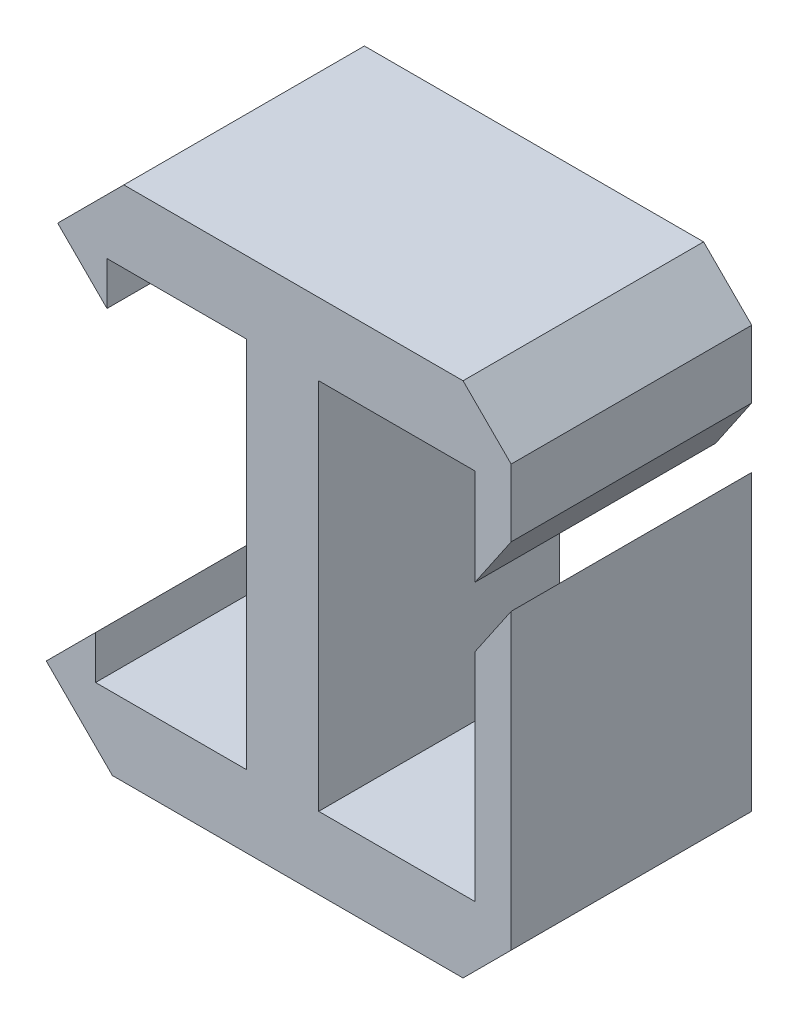
ISO-10303-21;
HEADER;
FILE_DESCRIPTION(('STEP AP214'),'2;1');
FILE_NAME('part.step','',(''),(''),'','','');
FILE_SCHEMA(('AUTOMOTIVE_DESIGN { 1 0 10303 214 1 1 1 1 }'));
ENDSEC;
DATA;
#1=APPLICATION_CONTEXT('core data for automotive mechanical design processes');
#2=APPLICATION_PROTOCOL_DEFINITION('international standard','automotive_design',2000,#1);
#3=PRODUCT_CONTEXT('',#1,'mechanical');
#4=PRODUCT('Part','Part','',(#3));
#5=PRODUCT_RELATED_PRODUCT_CATEGORY('part','',(#4));
#6=PRODUCT_DEFINITION_FORMATION('','',#4);
#7=PRODUCT_DEFINITION_CONTEXT('part definition',#1,'design');
#8=PRODUCT_DEFINITION('design','',#6,#7);
#9=PRODUCT_DEFINITION_SHAPE('','',#8);
#10=(LENGTH_UNIT() NAMED_UNIT(*) SI_UNIT(.MILLI.,.METRE.));
#11=(NAMED_UNIT(*) PLANE_ANGLE_UNIT() SI_UNIT($,.RADIAN.));
#12=(NAMED_UNIT(*) SI_UNIT($,.STERADIAN.) SOLID_ANGLE_UNIT());
#13=UNCERTAINTY_MEASURE_WITH_UNIT(LENGTH_MEASURE(1.E-05),#10,'distance_accuracy_value','');
#14=(GEOMETRIC_REPRESENTATION_CONTEXT(3) GLOBAL_UNCERTAINTY_ASSIGNED_CONTEXT((#13)) GLOBAL_UNIT_ASSIGNED_CONTEXT((#10,
#11,#12)) REPRESENTATION_CONTEXT('',''));
#15=CARTESIAN_POINT('',(0.,0.,0.));
#16=DIRECTION('',(0.,0.,1.));
#17=DIRECTION('',(1.,0.,0.));
#18=AXIS2_PLACEMENT_3D('',#15,#16,#17);
#19=CARTESIAN_POINT('',(-11.9544744209364,2.85150193237998,10.));
#20=DIRECTION('',(1.,0.,0.));
#21=DIRECTION('',(0.,1.,0.));
#22=AXIS2_PLACEMENT_3D('',#19,#20,#21);
#23=PLANE('',#22);
#24=DIRECTION('',(0.,-1.,0.));
#25=VECTOR('',#24,1.);
#26=CARTESIAN_POINT('',(-11.9544744209364,2.85150193237998,10.));
#27=LINE('',#26,#25);
#28=CARTESIAN_POINT('',(-11.9544744209364,3.1096578902488,10.));
#29=VERTEX_POINT('',#28);
#30=CARTESIAN_POINT('',(-11.9544744209364,1.3096578902488,10.));
#31=VERTEX_POINT('',#30);
#32=EDGE_CURVE('E216',#29,#31,#27,.T.);
#33=ORIENTED_EDGE('',*,*,#32,.T.);
#34=DIRECTION('',(0.,0.,1.));
#35=VECTOR('',#34,1.);
#36=CARTESIAN_POINT('',(-11.9544744209364,1.3096578902488,10.));
#37=LINE('',#36,#35);
#38=CARTESIAN_POINT('',(-11.9544744209364,1.3096578902488,0.));
#39=VERTEX_POINT('',#38);
#40=EDGE_CURVE('E391',#31,#39,#37,.F.);
#41=ORIENTED_EDGE('',*,*,#40,.T.);
#42=DIRECTION('',(0.,-1.,0.));
#43=VECTOR('',#42,1.);
#44=CARTESIAN_POINT('',(-11.9544744209364,2.85150193237998,0.));
#45=LINE('',#44,#43);
#46=CARTESIAN_POINT('',(-11.9544744209364,3.1096578902488,0.));
#47=VERTEX_POINT('',#46);
#48=EDGE_CURVE('E219',#47,#39,#45,.T.);
#49=ORIENTED_EDGE('',*,*,#48,.F.);
#50=DIRECTION('',(0.,0.,-1.));
#51=VECTOR('',#50,1.);
#52=CARTESIAN_POINT('',(-11.9544744209364,3.1096578902488,10.));
#53=LINE('',#52,#51);
#54=EDGE_CURVE('E214',#29,#47,#53,.T.);
#55=ORIENTED_EDGE('',*,*,#54,.F.);
#56=EDGE_LOOP('',(#33,#41,#49,#55));
#57=FACE_BOUND('',#56,.T.);
#58=ADVANCED_FACE('F16',(#57),#23,.T.);
#59=CARTESIAN_POINT('',(-6.16801259866785,3.1096578902488,10.));
#60=DIRECTION('',(0.,-1.,0.));
#61=DIRECTION('',(1.,0.,0.));
#62=AXIS2_PLACEMENT_3D('',#59,#60,#61);
#63=PLANE('',#62);
#64=DIRECTION('',(-1.,0.,0.));
#65=VECTOR('',#64,1.);
#66=CARTESIAN_POINT('',(-6.16801259866785,3.1096578902488,0.));
#67=LINE('',#66,#65);
#68=CARTESIAN_POINT('',(-6.15447442093638,3.1096578902488,0.));
#69=VERTEX_POINT('',#68);
#70=EDGE_CURVE('E296',#69,#47,#67,.T.);
#71=ORIENTED_EDGE('',*,*,#70,.F.);
#72=DIRECTION('',(0.,0.,-1.));
#73=VECTOR('',#72,1.);
#74=CARTESIAN_POINT('',(-6.15447442093638,3.1096578902488,10.));
#75=LINE('',#74,#73);
#76=CARTESIAN_POINT('',(-6.15447442093638,3.1096578902488,10.));
#77=VERTEX_POINT('',#76);
#78=EDGE_CURVE('E226',#77,#69,#75,.T.);
#79=ORIENTED_EDGE('',*,*,#78,.F.);
#80=DIRECTION('',(-1.,0.,0.));
#81=VECTOR('',#80,1.);
#82=CARTESIAN_POINT('',(-6.16801259866785,3.1096578902488,10.));
#83=LINE('',#82,#81);
#84=EDGE_CURVE('E231',#77,#29,#83,.T.);
#85=ORIENTED_EDGE('',*,*,#84,.T.);
#86=ORIENTED_EDGE('',*,*,#54,.T.);
#87=EDGE_LOOP('',(#71,#79,#85,#86));
#88=FACE_BOUND('',#87,.T.);
#89=ADVANCED_FACE('F238',(#88),#63,.T.);
#90=CARTESIAN_POINT('',(-6.15447442093638,-3.18937667277505,10.));
#91=DIRECTION('',(1.,0.,0.));
#92=DIRECTION('',(0.,1.,0.));
#93=AXIS2_PLACEMENT_3D('',#90,#91,#92);
#94=PLANE('',#93);
#95=DIRECTION('',(0.,-1.,0.));
#96=VECTOR('',#95,1.);
#97=CARTESIAN_POINT('',(-6.15447442093638,-3.18937667277505,0.));
#98=LINE('',#97,#96);
#99=CARTESIAN_POINT('',(-6.15447442093638,-12.3903421097512,0.));
#100=VERTEX_POINT('',#99);
#101=EDGE_CURVE('E298',#69,#100,#98,.T.);
#102=ORIENTED_EDGE('',*,*,#101,.T.);
#103=DIRECTION('',(0.,0.,-1.));
#104=VECTOR('',#103,1.);
#105=CARTESIAN_POINT('',(-6.15447442093638,-12.3903421097512,10.));
#106=LINE('',#105,#104);
#107=CARTESIAN_POINT('',(-6.15447442093638,-12.3903421097512,10.));
#108=VERTEX_POINT('',#107);
#109=EDGE_CURVE('E366',#108,#100,#106,.T.);
#110=ORIENTED_EDGE('',*,*,#109,.F.);
#111=DIRECTION('',(0.,-1.,0.));
#112=VECTOR('',#111,1.);
#113=CARTESIAN_POINT('',(-6.15447442093638,-3.18937667277505,10.));
#114=LINE('',#113,#112);
#115=EDGE_CURVE('E241',#77,#108,#114,.T.);
#116=ORIENTED_EDGE('',*,*,#115,.F.);
#117=ORIENTED_EDGE('',*,*,#78,.T.);
#118=EDGE_LOOP('',(#102,#110,#116,#117));
#119=FACE_BOUND('',#118,.T.);
#120=ADVANCED_FACE('F462',(#119),#94,.F.);
#121=CARTESIAN_POINT('',(-6.40506942601482,-12.3903421097512,10.));
#122=DIRECTION('',(0.,-1.,0.));
#123=DIRECTION('',(1.,0.,0.));
#124=AXIS2_PLACEMENT_3D('',#121,#122,#123);
#125=PLANE('',#124);
#126=DIRECTION('',(-1.,0.,0.));
#127=VECTOR('',#126,1.);
#128=CARTESIAN_POINT('',(-6.40506942601482,-12.3903421097512,0.));
#129=LINE('',#128,#127);
#130=CARTESIAN_POINT('',(-12.4285880756303,-12.3903421097512,0.));
#131=VERTEX_POINT('',#130);
#132=EDGE_CURVE('E309',#100,#131,#129,.T.);
#133=ORIENTED_EDGE('',*,*,#132,.T.);
#134=DIRECTION('',(0.,0.,-1.));
#135=VECTOR('',#134,1.);
#136=CARTESIAN_POINT('',(-12.4285880756303,-12.3903421097512,10.));
#137=LINE('',#136,#135);
#138=CARTESIAN_POINT('',(-12.4285880756303,-12.3903421097512,10.));
#139=VERTEX_POINT('',#138);
#140=EDGE_CURVE('E359',#139,#131,#137,.T.);
#141=ORIENTED_EDGE('',*,*,#140,.F.);
#142=DIRECTION('',(-1.,0.,0.));
#143=VECTOR('',#142,1.);
#144=CARTESIAN_POINT('',(-6.40506942601482,-12.3903421097512,10.));
#145=LINE('',#144,#143);
#146=EDGE_CURVE('E258',#108,#139,#145,.T.);
#147=ORIENTED_EDGE('',*,*,#146,.F.);
#148=ORIENTED_EDGE('',*,*,#109,.T.);
#149=EDGE_LOOP('',(#133,#141,#147,#148));
#150=FACE_BOUND('',#149,.T.);
#151=ADVANCED_FACE('F465',(#150),#125,.F.);
#152=CARTESIAN_POINT('',(-12.4285880756303,-13.1696809486542,10.));
#153=DIRECTION('',(-1.,0.,0.));
#154=DIRECTION('',(0.,-1.,0.));
#155=AXIS2_PLACEMENT_3D('',#152,#153,#154);
#156=PLANE('',#155);
#157=DIRECTION('',(0.,1.,0.));
#158=VECTOR('',#157,1.);
#159=CARTESIAN_POINT('',(-12.4285880756303,-13.1696809486542,0.));
#160=LINE('',#159,#158);
#161=CARTESIAN_POINT('',(-12.4285880756303,-10.5903421097512,0.));
#162=VERTEX_POINT('',#161);
#163=EDGE_CURVE('E312',#131,#162,#160,.T.);
#164=ORIENTED_EDGE('',*,*,#163,.T.);
#165=DIRECTION('',(0.,0.,-1.));
#166=VECTOR('',#165,1.);
#167=CARTESIAN_POINT('',(-12.4285880756303,-10.5903421097512,10.));
#168=LINE('',#167,#166);
#169=CARTESIAN_POINT('',(-12.4285880756303,-10.5903421097512,10.));
#170=VERTEX_POINT('',#169);
#171=EDGE_CURVE('E382',#162,#170,#168,.F.);
#172=ORIENTED_EDGE('',*,*,#171,.T.);
#173=DIRECTION('',(0.,1.,0.));
#174=VECTOR('',#173,1.);
#175=CARTESIAN_POINT('',(-12.4285880756303,-13.1696809486542,10.));
#176=LINE('',#175,#174);
#177=EDGE_CURVE('E261',#139,#170,#176,.T.);
#178=ORIENTED_EDGE('',*,*,#177,.F.);
#179=ORIENTED_EDGE('',*,*,#140,.T.);
#180=EDGE_LOOP('',(#164,#172,#178,#179));
#181=FACE_BOUND('',#180,.T.);
#182=ADVANCED_FACE('F549',(#181),#156,.F.);
#183=CARTESIAN_POINT('',(5.77486027864381,-15.3903421097512,10.));
#184=DIRECTION('',(0.,1.,0.));
#185=DIRECTION('',(0.,0.,1.));
#186=AXIS2_PLACEMENT_3D('',#183,#184,#185);
#187=PLANE('',#186);
#188=DIRECTION('',(1.,0.,0.));
#189=VECTOR('',#188,1.);
#190=CARTESIAN_POINT('',(5.77486027864381,-15.3903421097512,0.));
#191=LINE('',#190,#189);
#192=CARTESIAN_POINT('',(-11.7285880756303,-15.3903421097512,0.));
#193=VERTEX_POINT('',#192);
#194=CARTESIAN_POINT('',(2.84552557906362,-15.3903421097512,0.));
#195=VERTEX_POINT('',#194);
#196=EDGE_CURVE('E301',#193,#195,#191,.T.);
#197=ORIENTED_EDGE('',*,*,#196,.T.);
#198=DIRECTION('',(0.,0.,1.));
#199=VECTOR('',#198,1.);
#200=CARTESIAN_POINT('',(2.84552557906362,-15.3903421097512,10.));
#201=LINE('',#200,#199);
#202=CARTESIAN_POINT('',(2.84552557906362,-15.3903421097512,10.));
#203=VERTEX_POINT('',#202);
#204=EDGE_CURVE('E430',#195,#203,#201,.T.);
#205=ORIENTED_EDGE('',*,*,#204,.T.);
#206=DIRECTION('',(1.,0.,0.));
#207=VECTOR('',#206,1.);
#208=CARTESIAN_POINT('',(5.77486027864381,-15.3903421097512,10.));
#209=LINE('',#208,#207);
#210=CARTESIAN_POINT('',(-11.7285880756303,-15.3903421097512,10.));
#211=VERTEX_POINT('',#210);
#212=EDGE_CURVE('E247',#211,#203,#209,.T.);
#213=ORIENTED_EDGE('',*,*,#212,.F.);
#214=DIRECTION('',(0.,0.,-1.));
#215=VECTOR('',#214,1.);
#216=CARTESIAN_POINT('',(-11.7285880756303,-15.3903421097512,0.));
#217=LINE('',#216,#215);
#218=EDGE_CURVE('E394',#211,#193,#217,.T.);
#219=ORIENTED_EDGE('',*,*,#218,.T.);
#220=EDGE_LOOP('',(#197,#205,#213,#219));
#221=FACE_BOUND('',#220,.T.);
#222=ADVANCED_FACE('F482',(#221),#187,.F.);
#223=CARTESIAN_POINT('',(4.84552557906362,-13.674775353497,10.));
#224=DIRECTION('',(-1.,0.,0.));
#225=DIRECTION('',(0.,-1.,0.));
#226=AXIS2_PLACEMENT_3D('',#223,#224,#225);
#227=PLANE('',#226);
#228=DIRECTION('',(0.,1.,0.));
#229=VECTOR('',#228,1.);
#230=CARTESIAN_POINT('',(4.84552557906362,-13.674775353497,10.));
#231=LINE('',#230,#229);
#232=CARTESIAN_POINT('',(4.84552557906362,-13.3903421097512,10.));
#233=VERTEX_POINT('',#232);
#234=CARTESIAN_POINT('',(4.84552557906362,-1.1903421097512,10.));
#235=VERTEX_POINT('',#234);
#236=EDGE_CURVE('E265',#233,#235,#231,.T.);
#237=ORIENTED_EDGE('',*,*,#236,.F.);
#238=DIRECTION('',(0.,0.,-1.));
#239=VECTOR('',#238,1.);
#240=CARTESIAN_POINT('',(4.84552557906362,-13.3903421097512,10.));
#241=LINE('',#240,#239);
#242=CARTESIAN_POINT('',(4.84552557906362,-13.3903421097512,0.));
#243=VERTEX_POINT('',#242);
#244=EDGE_CURVE('E421',#233,#243,#241,.T.);
#245=ORIENTED_EDGE('',*,*,#244,.T.);
#246=DIRECTION('',(0.,1.,0.));
#247=VECTOR('',#246,1.);
#248=CARTESIAN_POINT('',(4.84552557906362,-13.674775353497,0.));
#249=LINE('',#248,#247);
#250=CARTESIAN_POINT('',(4.84552557906362,-1.1903421097512,0.));
#251=VERTEX_POINT('',#250);
#252=EDGE_CURVE('E316',#243,#251,#249,.T.);
#253=ORIENTED_EDGE('',*,*,#252,.T.);
#254=DIRECTION('',(0.,0.,-1.));
#255=VECTOR('',#254,1.);
#256=CARTESIAN_POINT('',(4.84552557906362,-1.1903421097512,10.));
#257=LINE('',#256,#255);
#258=EDGE_CURVE('E354',#235,#251,#257,.T.);
#259=ORIENTED_EDGE('',*,*,#258,.F.);
#260=EDGE_LOOP('',(#237,#245,#253,#259));
#261=FACE_BOUND('',#260,.T.);
#262=ADVANCED_FACE('F492',(#261),#227,.F.);
#263=CARTESIAN_POINT('',(4.67106450063209,-1.44621835811745,10.));
#264=DIRECTION('',(-0.826227342807548,0.56333682464151,0.));
#265=DIRECTION('',(-0.56333682464151,-0.826227342807548,0.));
#266=AXIS2_PLACEMENT_3D('',#263,#264,#265);
#267=PLANE('',#266);
#268=DIRECTION('',(0.56333682464151,0.826227342807548,0.));
#269=VECTOR('',#268,1.);
#270=CARTESIAN_POINT('',(4.67106450063209,-1.44621835811745,0.));
#271=LINE('',#270,#269);
#272=CARTESIAN_POINT('',(3.34552557906362,-3.3903421097512,0.));
#273=VERTEX_POINT('',#272);
#274=EDGE_CURVE('E322',#273,#251,#271,.T.);
#275=ORIENTED_EDGE('',*,*,#274,.F.);
#276=DIRECTION('',(0.,0.,-1.));
#277=VECTOR('',#276,1.);
#278=CARTESIAN_POINT('',(3.34552557906362,-3.3903421097512,10.));
#279=LINE('',#278,#277);
#280=CARTESIAN_POINT('',(3.34552557906362,-3.3903421097512,10.));
#281=VERTEX_POINT('',#280);
#282=EDGE_CURVE('E351',#281,#273,#279,.T.);
#283=ORIENTED_EDGE('',*,*,#282,.F.);
#284=DIRECTION('',(0.56333682464151,0.826227342807548,0.));
#285=VECTOR('',#284,1.);
#286=CARTESIAN_POINT('',(4.67106450063209,-1.44621835811745,10.));
#287=LINE('',#286,#285);
#288=EDGE_CURVE('E271',#281,#235,#287,.T.);
#289=ORIENTED_EDGE('',*,*,#288,.T.);
#290=ORIENTED_EDGE('',*,*,#258,.T.);
#291=EDGE_LOOP('',(#275,#283,#289,#290));
#292=FACE_BOUND('',#291,.T.);
#293=ADVANCED_FACE('F495',(#292),#267,.T.);
#294=CARTESIAN_POINT('',(3.34552557906362,-4.49034210975119,10.));
#295=DIRECTION('',(-1.,0.,0.));
#296=DIRECTION('',(0.,-1.,0.));
#297=AXIS2_PLACEMENT_3D('',#294,#295,#296);
#298=PLANE('',#297);
#299=DIRECTION('',(0.,1.,0.));
#300=VECTOR('',#299,1.);
#301=CARTESIAN_POINT('',(3.34552557906362,-4.49034210975119,0.));
#302=LINE('',#301,#300);
#303=CARTESIAN_POINT('',(3.34552557906362,-12.3903421097512,0.));
#304=VERTEX_POINT('',#303);
#305=EDGE_CURVE('E326',#304,#273,#302,.T.);
#306=ORIENTED_EDGE('',*,*,#305,.F.);
#307=DIRECTION('',(0.,0.,-1.));
#308=VECTOR('',#307,1.);
#309=CARTESIAN_POINT('',(3.34552557906362,-12.3903421097512,10.));
#310=LINE('',#309,#308);
#311=CARTESIAN_POINT('',(3.34552557906362,-12.3903421097512,10.));
#312=VERTEX_POINT('',#311);
#313=EDGE_CURVE('E355',#312,#304,#310,.T.);
#314=ORIENTED_EDGE('',*,*,#313,.F.);
#315=DIRECTION('',(0.,1.,0.));
#316=VECTOR('',#315,1.);
#317=CARTESIAN_POINT('',(3.34552557906362,-4.49034210975119,10.));
#318=LINE('',#317,#316);
#319=EDGE_CURVE('E275',#312,#281,#318,.T.);
#320=ORIENTED_EDGE('',*,*,#319,.T.);
#321=ORIENTED_EDGE('',*,*,#282,.T.);
#322=EDGE_LOOP('',(#306,#314,#320,#321));
#323=FACE_BOUND('',#322,.T.);
#324=ADVANCED_FACE('F499',(#323),#298,.T.);
#325=CARTESIAN_POINT('',(2.84552557906362,-12.3903421097512,10.));
#326=DIRECTION('',(0.,-1.,0.));
#327=DIRECTION('',(1.,0.,0.));
#328=AXIS2_PLACEMENT_3D('',#325,#326,#327);
#329=PLANE('',#328);
#330=DIRECTION('',(-1.,0.,0.));
#331=VECTOR('',#330,1.);
#332=CARTESIAN_POINT('',(2.84552557906362,-12.3903421097512,0.));
#333=LINE('',#332,#331);
#334=CARTESIAN_POINT('',(-3.15447442093638,-12.3903421097512,0.));
#335=VERTEX_POINT('',#334);
#336=EDGE_CURVE('E319',#304,#335,#333,.T.);
#337=ORIENTED_EDGE('',*,*,#336,.T.);
#338=DIRECTION('',(0.,0.,-1.));
#339=VECTOR('',#338,1.);
#340=CARTESIAN_POINT('',(-3.15447442093638,-12.3903421097512,10.));
#341=LINE('',#340,#339);
#342=CARTESIAN_POINT('',(-3.15447442093638,-12.3903421097512,10.));
#343=VERTEX_POINT('',#342);
#344=EDGE_CURVE('E362',#343,#335,#341,.T.);
#345=ORIENTED_EDGE('',*,*,#344,.F.);
#346=DIRECTION('',(-1.,0.,0.));
#347=VECTOR('',#346,1.);
#348=CARTESIAN_POINT('',(2.84552557906362,-12.3903421097512,10.));
#349=LINE('',#348,#347);
#350=EDGE_CURVE('E268',#312,#343,#349,.T.);
#351=ORIENTED_EDGE('',*,*,#350,.F.);
#352=ORIENTED_EDGE('',*,*,#313,.T.);
#353=EDGE_LOOP('',(#337,#345,#351,#352));
#354=FACE_BOUND('',#353,.T.);
#355=ADVANCED_FACE('F504',(#354),#329,.F.);
#356=CARTESIAN_POINT('',(-3.15447442093638,-2.38937667277505,10.));
#357=DIRECTION('',(1.,0.,0.));
#358=DIRECTION('',(0.,1.,0.));
#359=AXIS2_PLACEMENT_3D('',#356,#357,#358);
#360=PLANE('',#359);
#361=DIRECTION('',(0.,-1.,0.));
#362=VECTOR('',#361,1.);
#363=CARTESIAN_POINT('',(-3.15447442093638,-2.38937667277505,0.));
#364=LINE('',#363,#362);
#365=CARTESIAN_POINT('',(-3.15447442093638,3.1096578902488,0.));
#366=VERTEX_POINT('',#365);
#367=EDGE_CURVE('E305',#366,#335,#364,.T.);
#368=ORIENTED_EDGE('',*,*,#367,.F.);
#369=DIRECTION('',(0.,0.,-1.));
#370=VECTOR('',#369,1.);
#371=CARTESIAN_POINT('',(-3.15447442093638,3.1096578902488,10.));
#372=LINE('',#371,#370);
#373=CARTESIAN_POINT('',(-3.15447442093638,3.1096578902488,10.));
#374=VERTEX_POINT('',#373);
#375=EDGE_CURVE('E350',#374,#366,#372,.T.);
#376=ORIENTED_EDGE('',*,*,#375,.F.);
#377=DIRECTION('',(0.,-1.,0.));
#378=VECTOR('',#377,1.);
#379=CARTESIAN_POINT('',(-3.15447442093638,-2.38937667277505,10.));
#380=LINE('',#379,#378);
#381=EDGE_CURVE('E254',#374,#343,#380,.T.);
#382=ORIENTED_EDGE('',*,*,#381,.T.);
#383=ORIENTED_EDGE('',*,*,#344,.T.);
#384=EDGE_LOOP('',(#368,#376,#382,#383));
#385=FACE_BOUND('',#384,.T.);
#386=ADVANCED_FACE('F511',(#385),#360,.T.);
#387=CARTESIAN_POINT('',(6.35776181216465,3.1096578902488,10.));
#388=DIRECTION('',(0.,1.,0.));
#389=DIRECTION('',(0.,0.,1.));
#390=AXIS2_PLACEMENT_3D('',#387,#388,#389);
#391=PLANE('',#390);
#392=DIRECTION('',(1.,0.,0.));
#393=VECTOR('',#392,1.);
#394=CARTESIAN_POINT('',(6.35776181216465,3.1096578902488,0.));
#395=LINE('',#394,#393);
#396=CARTESIAN_POINT('',(3.34552557906362,3.1096578902488,0.));
#397=VERTEX_POINT('',#396);
#398=EDGE_CURVE('E330',#366,#397,#395,.T.);
#399=ORIENTED_EDGE('',*,*,#398,.T.);
#400=DIRECTION('',(0.,0.,-1.));
#401=VECTOR('',#400,1.);
#402=CARTESIAN_POINT('',(3.34552557906362,3.1096578902488,10.));
#403=LINE('',#402,#401);
#404=CARTESIAN_POINT('',(3.34552557906362,3.1096578902488,10.));
#405=VERTEX_POINT('',#404);
#406=EDGE_CURVE('E347',#405,#397,#403,.T.);
#407=ORIENTED_EDGE('',*,*,#406,.F.);
#408=DIRECTION('',(1.,0.,0.));
#409=VECTOR('',#408,1.);
#410=CARTESIAN_POINT('',(6.35776181216465,3.1096578902488,10.));
#411=LINE('',#410,#409);
#412=EDGE_CURVE('E279',#374,#405,#411,.T.);
#413=ORIENTED_EDGE('',*,*,#412,.F.);
#414=ORIENTED_EDGE('',*,*,#375,.T.);
#415=EDGE_LOOP('',(#399,#407,#413,#414));
#416=FACE_BOUND('',#415,.T.);
#417=ADVANCED_FACE('F514',(#416),#391,.F.);
#418=CARTESIAN_POINT('',(3.34552557906362,-0.890342109751197,0.));
#419=VERTEX_POINT('',#418);
#420=EDGE_CURVE('E331',#419,#397,#302,.T.);
#421=ORIENTED_EDGE('',*,*,#420,.F.);
#422=DIRECTION('',(0.,0.,-1.));
#423=VECTOR('',#422,1.);
#424=CARTESIAN_POINT('',(3.34552557906362,-0.890342109751197,10.));
#425=LINE('',#424,#423);
#426=CARTESIAN_POINT('',(3.34552557906362,-0.890342109751197,10.));
#427=VERTEX_POINT('',#426);
#428=EDGE_CURVE('E344',#427,#419,#425,.T.);
#429=ORIENTED_EDGE('',*,*,#428,.F.);
#430=EDGE_CURVE('E280',#427,#405,#318,.T.);
#431=ORIENTED_EDGE('',*,*,#430,.T.);
#432=ORIENTED_EDGE('',*,*,#406,.T.);
#433=EDGE_LOOP('',(#421,#429,#431,#432));
#434=FACE_BOUND('',#433,.T.);
#435=ADVANCED_FACE('F519',(#434),#298,.T.);
#436=CARTESIAN_POINT('',(4.96272062950624,1.48154396423131,10.));
#437=DIRECTION('',(-0.826227342807548,0.56333682464151,0.));
#438=DIRECTION('',(-0.56333682464151,-0.826227342807548,0.));
#439=AXIS2_PLACEMENT_3D('',#436,#437,#438);
#440=PLANE('',#439);
#441=DIRECTION('',(0.56333682464151,0.826227342807548,0.));
#442=VECTOR('',#441,1.);
#443=CARTESIAN_POINT('',(4.96272062950624,1.48154396423131,0.));
#444=LINE('',#443,#442);
#445=CARTESIAN_POINT('',(4.84552557906362,1.3096578902488,0.));
#446=VERTEX_POINT('',#445);
#447=EDGE_CURVE('E236',#419,#446,#444,.T.);
#448=ORIENTED_EDGE('',*,*,#447,.T.);
#449=DIRECTION('',(0.,0.,-1.));
#450=VECTOR('',#449,1.);
#451=CARTESIAN_POINT('',(4.84552557906362,1.3096578902488,10.));
#452=LINE('',#451,#450);
#453=CARTESIAN_POINT('',(4.84552557906362,1.3096578902488,10.));
#454=VERTEX_POINT('',#453);
#455=EDGE_CURVE('E290',#454,#446,#452,.T.);
#456=ORIENTED_EDGE('',*,*,#455,.F.);
#457=DIRECTION('',(0.56333682464151,0.826227342807548,0.));
#458=VECTOR('',#457,1.);
#459=CARTESIAN_POINT('',(4.96272062950624,1.48154396423131,10.));
#460=LINE('',#459,#458);
#461=EDGE_CURVE('E286',#427,#454,#460,.T.);
#462=ORIENTED_EDGE('',*,*,#461,.F.);
#463=ORIENTED_EDGE('',*,*,#428,.T.);
#464=EDGE_LOOP('',(#448,#456,#462,#463));
#465=FACE_BOUND('',#464,.T.);
#466=ADVANCED_FACE('F575',(#465),#440,.F.);
#467=CARTESIAN_POINT('',(4.84552557906362,4.53824315084691,10.));
#468=DIRECTION('',(1.,0.,0.));
#469=DIRECTION('',(0.,1.,0.));
#470=AXIS2_PLACEMENT_3D('',#467,#468,#469);
#471=PLANE('',#470);
#472=DIRECTION('',(0.,-1.,0.));
#473=VECTOR('',#472,1.);
#474=CARTESIAN_POINT('',(4.84552557906362,4.53824315084691,0.));
#475=LINE('',#474,#473);
#476=CARTESIAN_POINT('',(4.84552557906362,4.10965789024881,0.));
#477=VERTEX_POINT('',#476);
#478=EDGE_CURVE('E335',#477,#446,#475,.T.);
#479=ORIENTED_EDGE('',*,*,#478,.F.);
#480=DIRECTION('',(0.,0.,1.));
#481=VECTOR('',#480,1.);
#482=CARTESIAN_POINT('',(4.84552557906362,4.10965789024881,10.));
#483=LINE('',#482,#481);
#484=CARTESIAN_POINT('',(4.84552557906362,4.10965789024881,10.));
#485=VERTEX_POINT('',#484);
#486=EDGE_CURVE('E10',#477,#485,#483,.T.);
#487=ORIENTED_EDGE('',*,*,#486,.T.);
#488=DIRECTION('',(0.,-1.,0.));
#489=VECTOR('',#488,1.);
#490=CARTESIAN_POINT('',(4.84552557906362,4.53824315084691,10.));
#491=LINE('',#490,#489);
#492=EDGE_CURVE('E283',#485,#454,#491,.T.);
#493=ORIENTED_EDGE('',*,*,#492,.T.);
#494=ORIENTED_EDGE('',*,*,#455,.T.);
#495=EDGE_LOOP('',(#479,#487,#493,#494));
#496=FACE_BOUND('',#495,.T.);
#497=ADVANCED_FACE('F585',(#496),#471,.T.);
#498=CARTESIAN_POINT('',(-6.16801259866785,6.1096578902488,10.));
#499=DIRECTION('',(0.,-1.,0.));
#500=DIRECTION('',(1.,0.,0.));
#501=AXIS2_PLACEMENT_3D('',#498,#499,#500);
#502=PLANE('',#501);
#503=DIRECTION('',(-1.,0.,0.));
#504=VECTOR('',#503,1.);
#505=CARTESIAN_POINT('',(-6.16801259866785,6.1096578902488,10.));
#506=LINE('',#505,#504);
#507=CARTESIAN_POINT('',(2.84552557906362,6.1096578902488,10.));
#508=VERTEX_POINT('',#507);
#509=CARTESIAN_POINT('',(-11.2544744209364,6.1096578902488,10.));
#510=VERTEX_POINT('',#509);
#511=EDGE_CURVE('E235',#508,#510,#506,.T.);
#512=ORIENTED_EDGE('',*,*,#511,.F.);
#513=DIRECTION('',(0.,0.,-1.));
#514=VECTOR('',#513,1.);
#515=CARTESIAN_POINT('',(2.84552557906362,6.1096578902488,0.));
#516=LINE('',#515,#514);
#517=CARTESIAN_POINT('',(2.84552557906362,6.1096578902488,0.));
#518=VERTEX_POINT('',#517);
#519=EDGE_CURVE('E25',#508,#518,#516,.T.);
#520=ORIENTED_EDGE('',*,*,#519,.T.);
#521=DIRECTION('',(-1.,0.,0.));
#522=VECTOR('',#521,1.);
#523=CARTESIAN_POINT('',(-6.16801259866785,6.1096578902488,0.));
#524=LINE('',#523,#522);
#525=CARTESIAN_POINT('',(-11.2544744209364,6.1096578902488,0.));
#526=VERTEX_POINT('',#525);
#527=EDGE_CURVE('E293',#518,#526,#524,.T.);
#528=ORIENTED_EDGE('',*,*,#527,.T.);
#529=DIRECTION('',(0.,0.,1.));
#530=VECTOR('',#529,1.);
#531=CARTESIAN_POINT('',(-11.2544744209364,6.1096578902488,10.));
#532=LINE('',#531,#530);
#533=EDGE_CURVE('E417',#526,#510,#532,.T.);
#534=ORIENTED_EDGE('',*,*,#533,.T.);
#535=EDGE_LOOP('',(#512,#520,#528,#534));
#536=FACE_BOUND('',#535,.T.);
#537=ADVANCED_FACE('F443',(#536),#502,.F.);
#538=CARTESIAN_POINT('',(-4.19153124828335,-4.6403421097512,10.));
#539=DIRECTION('',(0.,0.,1.));
#540=DIRECTION('',(1.,0.,0.));
#541=AXIS2_PLACEMENT_3D('',#538,#539,#540);
#542=PLANE('',#541);
#543=ORIENTED_EDGE('',*,*,#212,.T.);
#544=DIRECTION('',(-0.707106781186548,-0.707106781186548,0.));
#545=VECTOR('',#544,1.);
#546=CARTESIAN_POINT('',(4.70199716539014,-13.5338705234247,10.));
#547=LINE('',#546,#545);
#548=EDGE_CURVE('E435',#203,#233,#547,.F.);
#549=ORIENTED_EDGE('',*,*,#548,.T.);
#550=ORIENTED_EDGE('',*,*,#236,.T.);
#551=ORIENTED_EDGE('',*,*,#288,.F.);
#552=ORIENTED_EDGE('',*,*,#319,.F.);
#553=ORIENTED_EDGE('',*,*,#350,.T.);
#554=ORIENTED_EDGE('',*,*,#381,.F.);
#555=ORIENTED_EDGE('',*,*,#412,.T.);
#556=ORIENTED_EDGE('',*,*,#430,.F.);
#557=ORIENTED_EDGE('',*,*,#461,.T.);
#558=ORIENTED_EDGE('',*,*,#492,.F.);
#559=DIRECTION('',(-0.707106781186548,0.707106781186547,0.));
#560=VECTOR('',#559,1.);
#561=CARTESIAN_POINT('',(4.70199716539013,4.25318630392229,10.));
#562=LINE('',#561,#560);
#563=EDGE_CURVE('E37',#485,#508,#562,.T.);
#564=ORIENTED_EDGE('',*,*,#563,.T.);
#565=ORIENTED_EDGE('',*,*,#511,.T.);
#566=DIRECTION('',(0.707106781186548,0.707106781186548,0.));
#567=VECTOR('',#566,1.);
#568=CARTESIAN_POINT('',(-13.0980028346099,4.26612947657532,10.));
#569=LINE('',#568,#567);
#570=CARTESIAN_POINT('',(-14.0044744209364,3.3596578902488,10.));
#571=VERTEX_POINT('',#570);
#572=EDGE_CURVE('E408',#510,#571,#569,.F.);
#573=ORIENTED_EDGE('',*,*,#572,.T.);
#574=DIRECTION('',(-0.707106781186548,0.707106781186548,0.));
#575=VECTOR('',#574,1.);
#576=CARTESIAN_POINT('',(-5.09800283460986,-5.54681369607771,10.));
#577=LINE('',#576,#575);
#578=EDGE_CURVE('E233',#571,#31,#577,.F.);
#579=ORIENTED_EDGE('',*,*,#578,.T.);
#580=ORIENTED_EDGE('',*,*,#32,.F.);
#581=ORIENTED_EDGE('',*,*,#84,.F.);
#582=ORIENTED_EDGE('',*,*,#115,.T.);
#583=ORIENTED_EDGE('',*,*,#146,.T.);
#584=ORIENTED_EDGE('',*,*,#177,.T.);
#585=DIRECTION('',(0.707106781186548,0.707106781186548,0.));
#586=VECTOR('',#585,1.);
#587=CARTESIAN_POINT('',(-5.33505966195683,-3.49681369607771,10.));
#588=LINE('',#587,#586);
#589=CARTESIAN_POINT('',(-14.4785880756303,-12.6403421097512,10.));
#590=VERTEX_POINT('',#589);
#591=EDGE_CURVE('E387',#170,#590,#588,.F.);
#592=ORIENTED_EDGE('',*,*,#591,.T.);
#593=DIRECTION('',(0.707106781186547,-0.707106781186548,0.));
#594=VECTOR('',#593,1.);
#595=CARTESIAN_POINT('',(-13.3350596619568,-13.7838705234247,10.));
#596=LINE('',#595,#594);
#597=EDGE_CURVE('E411',#590,#211,#596,.T.);
#598=ORIENTED_EDGE('',*,*,#597,.T.);
#599=EDGE_LOOP('',(#543,#549,#550,#551,#552,#553,#554,#555,#556,#557,#558,#564,#565,#573,#579,
#580,#581,#582,#583,#584,#592,#598));
#600=FACE_BOUND('',#599,.T.);
#601=ADVANCED_FACE('F230',(#600),#542,.T.);
#602=CARTESIAN_POINT('',(-4.19153124828335,-4.6403421097512,0.));
#603=DIRECTION('',(0.,0.,1.));
#604=DIRECTION('',(1.,0.,0.));
#605=AXIS2_PLACEMENT_3D('',#602,#603,#604);
#606=PLANE('',#605);
#607=ORIENTED_EDGE('',*,*,#252,.F.);
#608=DIRECTION('',(0.707106781186548,0.707106781186548,0.));
#609=VECTOR('',#608,1.);
#610=CARTESIAN_POINT('',(4.84552557906362,-13.3903421097512,0.));
#611=LINE('',#610,#609);
#612=EDGE_CURVE('E427',#243,#195,#611,.F.);
#613=ORIENTED_EDGE('',*,*,#612,.T.);
#614=ORIENTED_EDGE('',*,*,#196,.F.);
#615=DIRECTION('',(-0.707106781186547,0.707106781186548,0.));
#616=VECTOR('',#615,1.);
#617=CARTESIAN_POINT('',(-11.7285880756303,-15.3903421097512,0.));
#618=LINE('',#617,#616);
#619=CARTESIAN_POINT('',(-14.4785880756303,-12.6403421097512,0.));
#620=VERTEX_POINT('',#619);
#621=EDGE_CURVE('E402',#193,#620,#618,.T.);
#622=ORIENTED_EDGE('',*,*,#621,.T.);
#623=DIRECTION('',(-0.707106781186548,-0.707106781186548,0.));
#624=VECTOR('',#623,1.);
#625=CARTESIAN_POINT('',(-15.2285880756303,-13.3903421097512,0.));
#626=LINE('',#625,#624);
#627=EDGE_CURVE('E379',#620,#162,#626,.F.);
#628=ORIENTED_EDGE('',*,*,#627,.T.);
#629=ORIENTED_EDGE('',*,*,#163,.F.);
#630=ORIENTED_EDGE('',*,*,#132,.F.);
#631=ORIENTED_EDGE('',*,*,#101,.F.);
#632=ORIENTED_EDGE('',*,*,#70,.T.);
#633=ORIENTED_EDGE('',*,*,#48,.T.);
#634=DIRECTION('',(0.707106781186548,-0.707106781186548,0.));
#635=VECTOR('',#634,1.);
#636=CARTESIAN_POINT('',(-11.7544744209364,1.1096578902488,0.));
#637=LINE('',#636,#635);
#638=CARTESIAN_POINT('',(-14.0044744209364,3.3596578902488,0.));
#639=VERTEX_POINT('',#638);
#640=EDGE_CURVE('E225',#39,#639,#637,.F.);
#641=ORIENTED_EDGE('',*,*,#640,.T.);
#642=DIRECTION('',(-0.707106781186548,-0.707106781186548,0.));
#643=VECTOR('',#642,1.);
#644=CARTESIAN_POINT('',(-14.7544744209364,2.6096578902488,0.));
#645=LINE('',#644,#643);
#646=EDGE_CURVE('E398',#639,#526,#645,.F.);
#647=ORIENTED_EDGE('',*,*,#646,.T.);
#648=ORIENTED_EDGE('',*,*,#527,.F.);
#649=DIRECTION('',(0.707106781186548,-0.707106781186547,0.));
#650=VECTOR('',#649,1.);
#651=CARTESIAN_POINT('',(2.84552557906362,6.1096578902488,0.));
#652=LINE('',#651,#650);
#653=EDGE_CURVE('E424',#518,#477,#652,.T.);
#654=ORIENTED_EDGE('',*,*,#653,.T.);
#655=ORIENTED_EDGE('',*,*,#478,.T.);
#656=ORIENTED_EDGE('',*,*,#447,.F.);
#657=ORIENTED_EDGE('',*,*,#420,.T.);
#658=ORIENTED_EDGE('',*,*,#398,.F.);
#659=ORIENTED_EDGE('',*,*,#367,.T.);
#660=ORIENTED_EDGE('',*,*,#336,.F.);
#661=ORIENTED_EDGE('',*,*,#305,.T.);
#662=ORIENTED_EDGE('',*,*,#274,.T.);
#663=EDGE_LOOP('',(#607,#613,#614,#622,#628,#629,#630,#631,#632,#633,#641,#647,#648,#654,#655,
#656,#657,#658,#659,#660,#661,#662));
#664=FACE_BOUND('',#663,.T.);
#665=ADVANCED_FACE('F447',(#664),#606,.F.);
#666=CARTESIAN_POINT('',(-15.2285880756303,-13.3903421097512,10.));
#667=DIRECTION('',(0.707106781186548,-0.707106781186548,0.));
#668=DIRECTION('',(0.,0.,-1.));
#669=AXIS2_PLACEMENT_3D('',#666,#667,#668);
#670=PLANE('',#669);
#671=ORIENTED_EDGE('',*,*,#627,.F.);
#672=DIRECTION('',(0.,0.,-1.));
#673=VECTOR('',#672,1.);
#674=CARTESIAN_POINT('',(-14.4785880756303,-12.6403421097512,10.));
#675=LINE('',#674,#673);
#676=EDGE_CURVE('E405',#620,#590,#675,.F.);
#677=ORIENTED_EDGE('',*,*,#676,.T.);
#678=ORIENTED_EDGE('',*,*,#591,.F.);
#679=ORIENTED_EDGE('',*,*,#171,.F.);
#680=EDGE_LOOP('',(#671,#677,#678,#679));
#681=FACE_BOUND('',#680,.T.);
#682=ADVANCED_FACE('F474',(#681),#670,.F.);
#683=CARTESIAN_POINT('',(-11.7544744209364,1.1096578902488,10.));
#684=DIRECTION('',(0.707106781186548,0.707106781186548,0.));
#685=DIRECTION('',(0.,0.,-1.));
#686=AXIS2_PLACEMENT_3D('',#683,#684,#685);
#687=PLANE('',#686);
#688=ORIENTED_EDGE('',*,*,#578,.F.);
#689=DIRECTION('',(0.,0.,-1.));
#690=VECTOR('',#689,1.);
#691=CARTESIAN_POINT('',(-14.0044744209364,3.3596578902488,10.));
#692=LINE('',#691,#690);
#693=EDGE_CURVE('E414',#571,#639,#692,.T.);
#694=ORIENTED_EDGE('',*,*,#693,.T.);
#695=ORIENTED_EDGE('',*,*,#640,.F.);
#696=ORIENTED_EDGE('',*,*,#40,.F.);
#697=EDGE_LOOP('',(#688,#694,#695,#696));
#698=FACE_BOUND('',#697,.T.);
#699=ADVANCED_FACE('F456',(#698),#687,.F.);
#700=CARTESIAN_POINT('',(-11.7285880756303,-15.3903421097512,10.));
#701=DIRECTION('',(-0.707106781186548,-0.707106781186547,0.));
#702=DIRECTION('',(0.,0.,1.));
#703=AXIS2_PLACEMENT_3D('',#700,#701,#702);
#704=PLANE('',#703);
#705=ORIENTED_EDGE('',*,*,#597,.F.);
#706=ORIENTED_EDGE('',*,*,#676,.F.);
#707=ORIENTED_EDGE('',*,*,#621,.F.);
#708=ORIENTED_EDGE('',*,*,#218,.F.);
#709=EDGE_LOOP('',(#705,#706,#707,#708));
#710=FACE_BOUND('',#709,.T.);
#711=ADVANCED_FACE('F477',(#710),#704,.T.);
#712=CARTESIAN_POINT('',(-14.7544744209364,2.6096578902488,10.));
#713=DIRECTION('',(0.707106781186547,-0.707106781186548,0.));
#714=DIRECTION('',(0.,0.,-1.));
#715=AXIS2_PLACEMENT_3D('',#712,#713,#714);
#716=PLANE('',#715);
#717=ORIENTED_EDGE('',*,*,#572,.F.);
#718=ORIENTED_EDGE('',*,*,#533,.F.);
#719=ORIENTED_EDGE('',*,*,#646,.F.);
#720=ORIENTED_EDGE('',*,*,#693,.F.);
#721=EDGE_LOOP('',(#717,#718,#719,#720));
#722=FACE_BOUND('',#721,.T.);
#723=ADVANCED_FACE('F454',(#722),#716,.F.);
#724=CARTESIAN_POINT('',(4.84552557906362,-13.3903421097512,10.));
#725=DIRECTION('',(-0.707106781186548,0.707106781186548,0.));
#726=DIRECTION('',(0.,0.,-1.));
#727=AXIS2_PLACEMENT_3D('',#724,#725,#726);
#728=PLANE('',#727);
#729=ORIENTED_EDGE('',*,*,#548,.F.);
#730=ORIENTED_EDGE('',*,*,#204,.F.);
#731=ORIENTED_EDGE('',*,*,#612,.F.);
#732=ORIENTED_EDGE('',*,*,#244,.F.);
#733=EDGE_LOOP('',(#729,#730,#731,#732));
#734=FACE_BOUND('',#733,.T.);
#735=ADVANCED_FACE('F486',(#734),#728,.F.);
#736=CARTESIAN_POINT('',(2.84552557906362,6.1096578902488,10.));
#737=DIRECTION('',(0.707106781186547,0.707106781186548,0.));
#738=DIRECTION('',(0.,0.,1.));
#739=AXIS2_PLACEMENT_3D('',#736,#737,#738);
#740=PLANE('',#739);
#741=ORIENTED_EDGE('',*,*,#563,.F.);
#742=ORIENTED_EDGE('',*,*,#486,.F.);
#743=ORIENTED_EDGE('',*,*,#653,.F.);
#744=ORIENTED_EDGE('',*,*,#519,.F.);
#745=EDGE_LOOP('',(#741,#742,#743,#744));
#746=FACE_BOUND('',#745,.T.);
#747=ADVANCED_FACE('F18',(#746),#740,.T.);
#748=CLOSED_SHELL('',(#58,#89,#120,#151,#182,#222,#262,#293,#324,#355,#386,#417,#435,#466,#497,
#537,#601,#665,#682,#699,#711,#723,#735,#747));
#749=MANIFOLD_SOLID_BREP('B1',#748);
#750=ADVANCED_BREP_SHAPE_REPRESENTATION('',(#18,#749),#14);
#751=SHAPE_DEFINITION_REPRESENTATION(#9,#750);
ENDSEC;
END-ISO-10303-21;
